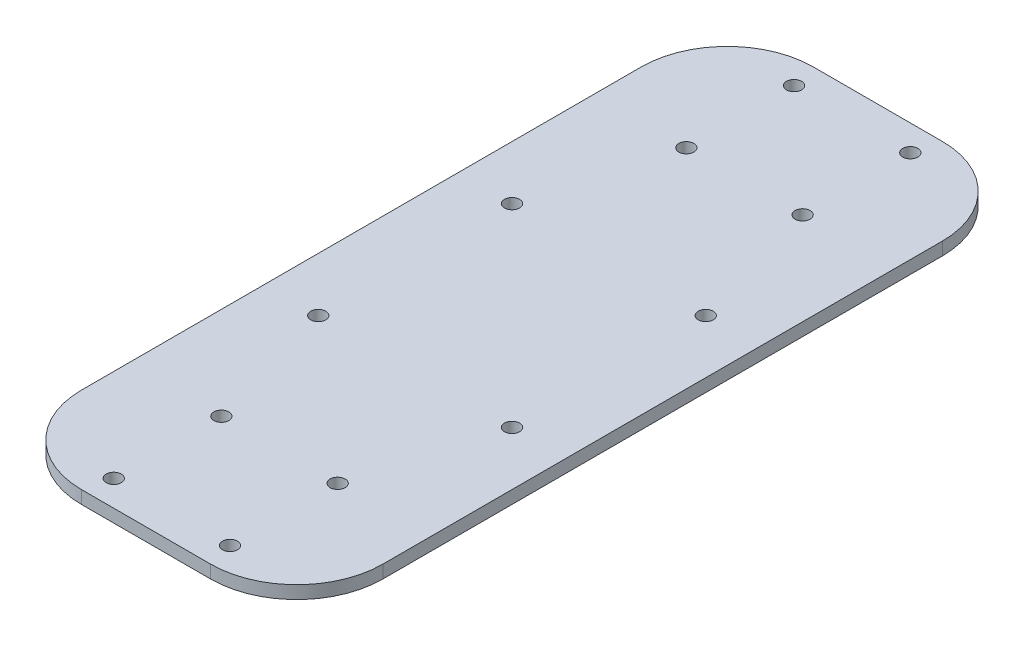
ISO-10303-21;
HEADER;
FILE_DESCRIPTION(('STEP AP214'),'2;1');
FILE_NAME('part.step','',(''),(''),'','','');
FILE_SCHEMA(('AUTOMOTIVE_DESIGN { 1 0 10303 214 1 1 1 1 }'));
ENDSEC;
DATA;
#1=APPLICATION_CONTEXT('core data for automotive mechanical design processes');
#2=APPLICATION_PROTOCOL_DEFINITION('international standard','automotive_design',2000,#1);
#3=PRODUCT_CONTEXT('',#1,'mechanical');
#4=PRODUCT('Part','Part','',(#3));
#5=PRODUCT_RELATED_PRODUCT_CATEGORY('part','',(#4));
#6=PRODUCT_DEFINITION_FORMATION('','',#4);
#7=PRODUCT_DEFINITION_CONTEXT('part definition',#1,'design');
#8=PRODUCT_DEFINITION('design','',#6,#7);
#9=PRODUCT_DEFINITION_SHAPE('','',#8);
#10=(LENGTH_UNIT() NAMED_UNIT(*) SI_UNIT(.MILLI.,.METRE.));
#11=(NAMED_UNIT(*) PLANE_ANGLE_UNIT() SI_UNIT($,.RADIAN.));
#12=(NAMED_UNIT(*) SI_UNIT($,.STERADIAN.) SOLID_ANGLE_UNIT());
#13=UNCERTAINTY_MEASURE_WITH_UNIT(LENGTH_MEASURE(1.E-05),#10,'distance_accuracy_value','');
#14=(GEOMETRIC_REPRESENTATION_CONTEXT(3) GLOBAL_UNCERTAINTY_ASSIGNED_CONTEXT((#13)) GLOBAL_UNIT_ASSIGNED_CONTEXT((#10,
#11,#12)) REPRESENTATION_CONTEXT('',''));
#15=CARTESIAN_POINT('',(0.,0.,0.));
#16=DIRECTION('',(0.,0.,1.));
#17=DIRECTION('',(1.,0.,0.));
#18=AXIS2_PLACEMENT_3D('',#15,#16,#17);
#19=CARTESIAN_POINT('',(0.,3.,0.));
#20=DIRECTION('',(0.,1.,0.));
#21=DIRECTION('',(0.,0.,1.));
#22=AXIS2_PLACEMENT_3D('',#19,#20,#21);
#23=PLANE('',#22);
#24=CARTESIAN_POINT('',(-13.5,3.,54.));
#25=DIRECTION('',(0.,-1.,0.));
#26=DIRECTION('',(0.,0.,-1.));
#27=AXIS2_PLACEMENT_3D('',#24,#25,#26);
#28=CIRCLE('',#27,1.75);
#29=CARTESIAN_POINT('',(-13.5,3.,52.25));
#30=VERTEX_POINT('',#29);
#31=EDGE_CURVE('E238',#30,#30,#28,.T.);
#32=ORIENTED_EDGE('',*,*,#31,.T.);
#33=EDGE_LOOP('',(#32));
#34=FACE_BOUND('',#33,.T.);
#35=CARTESIAN_POINT('',(13.5,3.,54.));
#36=DIRECTION('',(0.,-1.,0.));
#37=DIRECTION('',(0.,0.,-1.));
#38=AXIS2_PLACEMENT_3D('',#35,#36,#37);
#39=CIRCLE('',#38,1.75);
#40=CARTESIAN_POINT('',(13.5,3.,52.25));
#41=VERTEX_POINT('',#40);
#42=EDGE_CURVE('E244',#41,#41,#39,.T.);
#43=ORIENTED_EDGE('',*,*,#42,.T.);
#44=EDGE_LOOP('',(#43));
#45=FACE_BOUND('',#44,.T.);
#46=CARTESIAN_POINT('',(13.5,3.,79.));
#47=DIRECTION('',(0.,-1.,0.));
#48=DIRECTION('',(0.,0.,-1.));
#49=AXIS2_PLACEMENT_3D('',#46,#47,#48);
#50=CIRCLE('',#49,1.75);
#51=CARTESIAN_POINT('',(13.5,3.,77.25));
#52=VERTEX_POINT('',#51);
#53=EDGE_CURVE('E232',#52,#52,#50,.T.);
#54=ORIENTED_EDGE('',*,*,#53,.T.);
#55=EDGE_LOOP('',(#54));
#56=FACE_BOUND('',#55,.T.);
#57=CARTESIAN_POINT('',(-13.5,3.,79.));
#58=DIRECTION('',(0.,-1.,0.));
#59=DIRECTION('',(0.,0.,-1.));
#60=AXIS2_PLACEMENT_3D('',#57,#58,#59);
#61=CIRCLE('',#60,1.75);
#62=CARTESIAN_POINT('',(-13.5,3.,77.25));
#63=VERTEX_POINT('',#62);
#64=EDGE_CURVE('E215',#63,#63,#61,.T.);
#65=ORIENTED_EDGE('',*,*,#64,.T.);
#66=EDGE_LOOP('',(#65));
#67=FACE_BOUND('',#66,.T.);
#68=CARTESIAN_POINT('',(-13.5,3.,-54.));
#69=DIRECTION('',(0.,1.,0.));
#70=DIRECTION('',(0.,0.,1.));
#71=AXIS2_PLACEMENT_3D('',#68,#69,#70);
#72=CIRCLE('',#71,1.75);
#73=CARTESIAN_POINT('',(-13.5,3.,-52.25));
#74=VERTEX_POINT('',#73);
#75=EDGE_CURVE('E214',#74,#74,#72,.T.);
#76=ORIENTED_EDGE('',*,*,#75,.F.);
#77=EDGE_LOOP('',(#76));
#78=FACE_BOUND('',#77,.T.);
#79=CARTESIAN_POINT('',(13.5,3.,-54.));
#80=DIRECTION('',(0.,1.,0.));
#81=DIRECTION('',(0.,0.,1.));
#82=AXIS2_PLACEMENT_3D('',#79,#80,#81);
#83=CIRCLE('',#82,1.75);
#84=CARTESIAN_POINT('',(13.5,3.,-52.25));
#85=VERTEX_POINT('',#84);
#86=EDGE_CURVE('E221',#85,#85,#83,.T.);
#87=ORIENTED_EDGE('',*,*,#86,.F.);
#88=EDGE_LOOP('',(#87));
#89=FACE_BOUND('',#88,.T.);
#90=CARTESIAN_POINT('',(13.5,3.,-79.));
#91=DIRECTION('',(0.,1.,0.));
#92=DIRECTION('',(0.,0.,1.));
#93=AXIS2_PLACEMENT_3D('',#90,#91,#92);
#94=CIRCLE('',#93,1.75);
#95=CARTESIAN_POINT('',(13.5,3.,-77.25));
#96=VERTEX_POINT('',#95);
#97=EDGE_CURVE('E208',#96,#96,#94,.T.);
#98=ORIENTED_EDGE('',*,*,#97,.F.);
#99=EDGE_LOOP('',(#98));
#100=FACE_BOUND('',#99,.T.);
#101=CARTESIAN_POINT('',(-13.5,3.,-79.));
#102=DIRECTION('',(0.,1.,0.));
#103=DIRECTION('',(0.,0.,1.));
#104=AXIS2_PLACEMENT_3D('',#101,#102,#103);
#105=CIRCLE('',#104,1.75);
#106=CARTESIAN_POINT('',(-13.5,3.,-77.25));
#107=VERTEX_POINT('',#106);
#108=EDGE_CURVE('E202',#107,#107,#105,.T.);
#109=ORIENTED_EDGE('',*,*,#108,.F.);
#110=EDGE_LOOP('',(#109));
#111=FACE_BOUND('',#110,.T.);
#112=CARTESIAN_POINT('',(-22.5,3.,22.5));
#113=DIRECTION('',(0.,1.,0.));
#114=DIRECTION('',(0.,0.,-1.));
#115=AXIS2_PLACEMENT_3D('',#112,#113,#114);
#116=CIRCLE('',#115,1.75);
#117=CARTESIAN_POINT('',(-22.5,3.,20.75));
#118=VERTEX_POINT('',#117);
#119=EDGE_CURVE('E190',#118,#118,#116,.T.);
#120=ORIENTED_EDGE('',*,*,#119,.F.);
#121=EDGE_LOOP('',(#120));
#122=FACE_BOUND('',#121,.T.);
#123=CARTESIAN_POINT('',(-22.5,3.,-22.5));
#124=DIRECTION('',(0.,1.,0.));
#125=DIRECTION('',(0.,0.,1.));
#126=AXIS2_PLACEMENT_3D('',#123,#124,#125);
#127=CIRCLE('',#126,1.75);
#128=CARTESIAN_POINT('',(-22.5,3.,-20.75));
#129=VERTEX_POINT('',#128);
#130=EDGE_CURVE('E131',#129,#129,#127,.T.);
#131=ORIENTED_EDGE('',*,*,#130,.F.);
#132=EDGE_LOOP('',(#131));
#133=FACE_BOUND('',#132,.T.);
#134=DIRECTION('',(0.,0.,-1.));
#135=VECTOR('',#134,1.);
#136=CARTESIAN_POINT('',(35.,3.,85.));
#137=LINE('',#136,#135);
#138=CARTESIAN_POINT('',(35.,3.,65.));
#139=VERTEX_POINT('',#138);
#140=CARTESIAN_POINT('',(35.,3.,-65.));
#141=VERTEX_POINT('',#140);
#142=EDGE_CURVE('E140',#139,#141,#137,.T.);
#143=ORIENTED_EDGE('',*,*,#142,.T.);
#144=CARTESIAN_POINT('',(15.,3.,-65.));
#145=DIRECTION('',(0.,1.,0.));
#146=DIRECTION('',(0.,0.,1.));
#147=AXIS2_PLACEMENT_3D('',#144,#145,#146);
#148=CIRCLE('',#147,20.);
#149=CARTESIAN_POINT('',(15.,3.,-85.));
#150=VERTEX_POINT('',#149);
#151=EDGE_CURVE('E159',#141,#150,#148,.T.);
#152=ORIENTED_EDGE('',*,*,#151,.T.);
#153=DIRECTION('',(-1.,0.,0.));
#154=VECTOR('',#153,1.);
#155=CARTESIAN_POINT('',(35.,3.,-85.));
#156=LINE('',#155,#154);
#157=CARTESIAN_POINT('',(-15.,3.,-85.));
#158=VERTEX_POINT('',#157);
#159=EDGE_CURVE('E123',#150,#158,#156,.T.);
#160=ORIENTED_EDGE('',*,*,#159,.T.);
#161=CARTESIAN_POINT('',(-15.,3.,-65.));
#162=DIRECTION('',(0.,1.,0.));
#163=DIRECTION('',(0.,0.,1.));
#164=AXIS2_PLACEMENT_3D('',#161,#162,#163);
#165=CIRCLE('',#164,20.);
#166=CARTESIAN_POINT('',(-35.,3.,-65.));
#167=VERTEX_POINT('',#166);
#168=EDGE_CURVE('E157',#158,#167,#165,.T.);
#169=ORIENTED_EDGE('',*,*,#168,.T.);
#170=DIRECTION('',(0.,0.,1.));
#171=VECTOR('',#170,1.);
#172=CARTESIAN_POINT('',(-35.,3.,-85.));
#173=LINE('',#172,#171);
#174=CARTESIAN_POINT('',(-35.,3.,65.));
#175=VERTEX_POINT('',#174);
#176=EDGE_CURVE('E170',#167,#175,#173,.T.);
#177=ORIENTED_EDGE('',*,*,#176,.T.);
#178=CARTESIAN_POINT('',(-15.,3.,65.));
#179=DIRECTION('',(0.,1.,0.));
#180=DIRECTION('',(0.,0.,1.));
#181=AXIS2_PLACEMENT_3D('',#178,#179,#180);
#182=CIRCLE('',#181,20.);
#183=CARTESIAN_POINT('',(-15.,3.,85.));
#184=VERTEX_POINT('',#183);
#185=EDGE_CURVE('E58',#175,#184,#182,.T.);
#186=ORIENTED_EDGE('',*,*,#185,.T.);
#187=DIRECTION('',(1.,0.,0.));
#188=VECTOR('',#187,1.);
#189=CARTESIAN_POINT('',(35.,3.,85.));
#190=LINE('',#189,#188);
#191=CARTESIAN_POINT('',(15.,3.,85.));
#192=VERTEX_POINT('',#191);
#193=EDGE_CURVE('E178',#184,#192,#190,.T.);
#194=ORIENTED_EDGE('',*,*,#193,.T.);
#195=CARTESIAN_POINT('',(15.,3.,65.));
#196=DIRECTION('',(0.,1.,0.));
#197=DIRECTION('',(0.,0.,1.));
#198=AXIS2_PLACEMENT_3D('',#195,#196,#197);
#199=CIRCLE('',#198,20.);
#200=EDGE_CURVE('E154',#192,#139,#199,.T.);
#201=ORIENTED_EDGE('',*,*,#200,.T.);
#202=EDGE_LOOP('',(#143,#152,#160,#169,#177,#186,#194,#201));
#203=FACE_BOUND('',#202,.T.);
#204=CARTESIAN_POINT('',(22.5,3.,-22.5));
#205=DIRECTION('',(0.,1.,0.));
#206=DIRECTION('',(0.,0.,1.));
#207=AXIS2_PLACEMENT_3D('',#204,#205,#206);
#208=CIRCLE('',#207,1.75);
#209=CARTESIAN_POINT('',(22.5,3.,-20.75));
#210=VERTEX_POINT('',#209);
#211=EDGE_CURVE('E185',#210,#210,#208,.T.);
#212=ORIENTED_EDGE('',*,*,#211,.F.);
#213=EDGE_LOOP('',(#212));
#214=FACE_BOUND('',#213,.T.);
#215=CARTESIAN_POINT('',(22.5,3.,22.5));
#216=DIRECTION('',(0.,1.,0.));
#217=DIRECTION('',(0.,0.,-1.));
#218=AXIS2_PLACEMENT_3D('',#215,#216,#217);
#219=CIRCLE('',#218,1.75);
#220=CARTESIAN_POINT('',(22.5,3.,20.75));
#221=VERTEX_POINT('',#220);
#222=EDGE_CURVE('E196',#221,#221,#219,.T.);
#223=ORIENTED_EDGE('',*,*,#222,.F.);
#224=EDGE_LOOP('',(#223));
#225=FACE_BOUND('',#224,.T.);
#226=ADVANCED_FACE('F37',(#34,#45,#56,#67,#78,#89,#100,#111,#122,#133,#203,#214,#225),#23,.T.);
#227=CARTESIAN_POINT('',(0.,0.,0.));
#228=DIRECTION('',(0.,1.,0.));
#229=DIRECTION('',(0.,0.,1.));
#230=AXIS2_PLACEMENT_3D('',#227,#228,#229);
#231=PLANE('',#230);
#232=CARTESIAN_POINT('',(-13.5,0.,54.));
#233=DIRECTION('',(0.,-1.,0.));
#234=DIRECTION('',(0.,0.,-1.));
#235=AXIS2_PLACEMENT_3D('',#232,#233,#234);
#236=CIRCLE('',#235,1.75);
#237=CARTESIAN_POINT('',(-13.5,0.,52.25));
#238=VERTEX_POINT('',#237);
#239=EDGE_CURVE('E235',#238,#238,#236,.T.);
#240=ORIENTED_EDGE('',*,*,#239,.F.);
#241=EDGE_LOOP('',(#240));
#242=FACE_BOUND('',#241,.T.);
#243=CARTESIAN_POINT('',(13.5,0.,54.));
#244=DIRECTION('',(0.,-1.,0.));
#245=DIRECTION('',(0.,0.,-1.));
#246=AXIS2_PLACEMENT_3D('',#243,#244,#245);
#247=CIRCLE('',#246,1.75);
#248=CARTESIAN_POINT('',(13.5,0.,52.25));
#249=VERTEX_POINT('',#248);
#250=EDGE_CURVE('E241',#249,#249,#247,.T.);
#251=ORIENTED_EDGE('',*,*,#250,.F.);
#252=EDGE_LOOP('',(#251));
#253=FACE_BOUND('',#252,.T.);
#254=CARTESIAN_POINT('',(13.5,0.,79.));
#255=DIRECTION('',(0.,-1.,0.));
#256=DIRECTION('',(0.,0.,-1.));
#257=AXIS2_PLACEMENT_3D('',#254,#255,#256);
#258=CIRCLE('',#257,1.75);
#259=CARTESIAN_POINT('',(13.5,0.,77.25));
#260=VERTEX_POINT('',#259);
#261=EDGE_CURVE('E247',#260,#260,#258,.T.);
#262=ORIENTED_EDGE('',*,*,#261,.F.);
#263=EDGE_LOOP('',(#262));
#264=FACE_BOUND('',#263,.T.);
#265=CARTESIAN_POINT('',(-13.5,0.,79.));
#266=DIRECTION('',(0.,-1.,0.));
#267=DIRECTION('',(0.,0.,-1.));
#268=AXIS2_PLACEMENT_3D('',#265,#266,#267);
#269=CIRCLE('',#268,1.75);
#270=CARTESIAN_POINT('',(-13.5,0.,77.25));
#271=VERTEX_POINT('',#270);
#272=EDGE_CURVE('E229',#271,#271,#269,.T.);
#273=ORIENTED_EDGE('',*,*,#272,.F.);
#274=EDGE_LOOP('',(#273));
#275=FACE_BOUND('',#274,.T.);
#276=CARTESIAN_POINT('',(-13.5,0.,-54.));
#277=DIRECTION('',(0.,1.,0.));
#278=DIRECTION('',(0.,0.,1.));
#279=AXIS2_PLACEMENT_3D('',#276,#277,#278);
#280=CIRCLE('',#279,1.75);
#281=CARTESIAN_POINT('',(-13.5,0.,-52.25));
#282=VERTEX_POINT('',#281);
#283=EDGE_CURVE('E211',#282,#282,#280,.T.);
#284=ORIENTED_EDGE('',*,*,#283,.T.);
#285=EDGE_LOOP('',(#284));
#286=FACE_BOUND('',#285,.T.);
#287=CARTESIAN_POINT('',(13.5,0.,-54.));
#288=DIRECTION('',(0.,1.,0.));
#289=DIRECTION('',(0.,0.,1.));
#290=AXIS2_PLACEMENT_3D('',#287,#288,#289);
#291=CIRCLE('',#290,1.75);
#292=CARTESIAN_POINT('',(13.5,0.,-52.25));
#293=VERTEX_POINT('',#292);
#294=EDGE_CURVE('E218',#293,#293,#291,.T.);
#295=ORIENTED_EDGE('',*,*,#294,.T.);
#296=EDGE_LOOP('',(#295));
#297=FACE_BOUND('',#296,.T.);
#298=CARTESIAN_POINT('',(13.5,0.,-79.));
#299=DIRECTION('',(0.,1.,0.));
#300=DIRECTION('',(0.,0.,1.));
#301=AXIS2_PLACEMENT_3D('',#298,#299,#300);
#302=CIRCLE('',#301,1.75);
#303=CARTESIAN_POINT('',(13.5,0.,-77.25));
#304=VERTEX_POINT('',#303);
#305=EDGE_CURVE('E224',#304,#304,#302,.T.);
#306=ORIENTED_EDGE('',*,*,#305,.T.);
#307=EDGE_LOOP('',(#306));
#308=FACE_BOUND('',#307,.T.);
#309=CARTESIAN_POINT('',(-13.5,0.,-79.));
#310=DIRECTION('',(0.,1.,0.));
#311=DIRECTION('',(0.,0.,1.));
#312=AXIS2_PLACEMENT_3D('',#309,#310,#311);
#313=CIRCLE('',#312,1.75);
#314=CARTESIAN_POINT('',(-13.5,0.,-77.25));
#315=VERTEX_POINT('',#314);
#316=EDGE_CURVE('E205',#315,#315,#313,.T.);
#317=ORIENTED_EDGE('',*,*,#316,.T.);
#318=EDGE_LOOP('',(#317));
#319=FACE_BOUND('',#318,.T.);
#320=DIRECTION('',(-1.,0.,0.));
#321=VECTOR('',#320,1.);
#322=CARTESIAN_POINT('',(35.,0.,-85.));
#323=LINE('',#322,#321);
#324=CARTESIAN_POINT('',(15.,0.,-85.));
#325=VERTEX_POINT('',#324);
#326=CARTESIAN_POINT('',(-15.,0.,-85.));
#327=VERTEX_POINT('',#326);
#328=EDGE_CURVE('E120',#325,#327,#323,.T.);
#329=ORIENTED_EDGE('',*,*,#328,.F.);
#330=CARTESIAN_POINT('',(15.,0.,-65.));
#331=DIRECTION('',(0.,1.,0.));
#332=DIRECTION('',(0.,0.,1.));
#333=AXIS2_PLACEMENT_3D('',#330,#331,#332);
#334=CIRCLE('',#333,20.);
#335=CARTESIAN_POINT('',(35.,0.,-65.));
#336=VERTEX_POINT('',#335);
#337=EDGE_CURVE('E103',#325,#336,#334,.F.);
#338=ORIENTED_EDGE('',*,*,#337,.T.);
#339=DIRECTION('',(0.,0.,-1.));
#340=VECTOR('',#339,1.);
#341=CARTESIAN_POINT('',(35.,0.,85.));
#342=LINE('',#341,#340);
#343=CARTESIAN_POINT('',(35.,0.,65.));
#344=VERTEX_POINT('',#343);
#345=EDGE_CURVE('E144',#344,#336,#342,.T.);
#346=ORIENTED_EDGE('',*,*,#345,.F.);
#347=CARTESIAN_POINT('',(15.,0.,65.));
#348=DIRECTION('',(0.,1.,0.));
#349=DIRECTION('',(0.,0.,1.));
#350=AXIS2_PLACEMENT_3D('',#347,#348,#349);
#351=CIRCLE('',#350,20.);
#352=CARTESIAN_POINT('',(15.,0.,85.));
#353=VERTEX_POINT('',#352);
#354=EDGE_CURVE('E124',#344,#353,#351,.F.);
#355=ORIENTED_EDGE('',*,*,#354,.T.);
#356=DIRECTION('',(1.,0.,0.));
#357=VECTOR('',#356,1.);
#358=CARTESIAN_POINT('',(35.,0.,85.));
#359=LINE('',#358,#357);
#360=CARTESIAN_POINT('',(-15.,0.,85.));
#361=VERTEX_POINT('',#360);
#362=EDGE_CURVE('E134',#361,#353,#359,.T.);
#363=ORIENTED_EDGE('',*,*,#362,.F.);
#364=CARTESIAN_POINT('',(-15.,0.,65.));
#365=DIRECTION('',(0.,1.,0.));
#366=DIRECTION('',(0.,0.,1.));
#367=AXIS2_PLACEMENT_3D('',#364,#365,#366);
#368=CIRCLE('',#367,20.);
#369=CARTESIAN_POINT('',(-35.,0.,65.));
#370=VERTEX_POINT('',#369);
#371=EDGE_CURVE('E148',#361,#370,#368,.F.);
#372=ORIENTED_EDGE('',*,*,#371,.T.);
#373=DIRECTION('',(0.,0.,1.));
#374=VECTOR('',#373,1.);
#375=CARTESIAN_POINT('',(-35.,0.,-85.));
#376=LINE('',#375,#374);
#377=CARTESIAN_POINT('',(-35.,0.,-65.));
#378=VERTEX_POINT('',#377);
#379=EDGE_CURVE('E130',#378,#370,#376,.T.);
#380=ORIENTED_EDGE('',*,*,#379,.F.);
#381=CARTESIAN_POINT('',(-15.,0.,-65.));
#382=DIRECTION('',(0.,1.,0.));
#383=DIRECTION('',(0.,0.,1.));
#384=AXIS2_PLACEMENT_3D('',#381,#382,#383);
#385=CIRCLE('',#384,20.);
#386=EDGE_CURVE('E114',#378,#327,#385,.F.);
#387=ORIENTED_EDGE('',*,*,#386,.T.);
#388=EDGE_LOOP('',(#329,#338,#346,#355,#363,#372,#380,#387));
#389=FACE_BOUND('',#388,.T.);
#390=CARTESIAN_POINT('',(-22.5,0.,-22.5));
#391=DIRECTION('',(0.,1.,0.));
#392=DIRECTION('',(0.,0.,1.));
#393=AXIS2_PLACEMENT_3D('',#390,#391,#392);
#394=CIRCLE('',#393,1.75);
#395=CARTESIAN_POINT('',(-22.5,0.,-20.75));
#396=VERTEX_POINT('',#395);
#397=EDGE_CURVE('E137',#396,#396,#394,.T.);
#398=ORIENTED_EDGE('',*,*,#397,.T.);
#399=EDGE_LOOP('',(#398));
#400=FACE_BOUND('',#399,.T.);
#401=CARTESIAN_POINT('',(22.5,0.,-22.5));
#402=DIRECTION('',(0.,1.,0.));
#403=DIRECTION('',(0.,0.,1.));
#404=AXIS2_PLACEMENT_3D('',#401,#402,#403);
#405=CIRCLE('',#404,1.75);
#406=CARTESIAN_POINT('',(22.5,0.,-20.75));
#407=VERTEX_POINT('',#406);
#408=EDGE_CURVE('E187',#407,#407,#405,.T.);
#409=ORIENTED_EDGE('',*,*,#408,.T.);
#410=EDGE_LOOP('',(#409));
#411=FACE_BOUND('',#410,.T.);
#412=CARTESIAN_POINT('',(-22.5,0.,22.5));
#413=DIRECTION('',(0.,1.,0.));
#414=DIRECTION('',(0.,0.,-1.));
#415=AXIS2_PLACEMENT_3D('',#412,#413,#414);
#416=CIRCLE('',#415,1.75);
#417=CARTESIAN_POINT('',(-22.5,0.,20.75));
#418=VERTEX_POINT('',#417);
#419=EDGE_CURVE('E193',#418,#418,#416,.T.);
#420=ORIENTED_EDGE('',*,*,#419,.T.);
#421=EDGE_LOOP('',(#420));
#422=FACE_BOUND('',#421,.T.);
#423=CARTESIAN_POINT('',(22.5,0.,22.5));
#424=DIRECTION('',(0.,1.,0.));
#425=DIRECTION('',(0.,0.,-1.));
#426=AXIS2_PLACEMENT_3D('',#423,#424,#425);
#427=CIRCLE('',#426,1.75);
#428=CARTESIAN_POINT('',(22.5,0.,20.75));
#429=VERTEX_POINT('',#428);
#430=EDGE_CURVE('E199',#429,#429,#427,.T.);
#431=ORIENTED_EDGE('',*,*,#430,.T.);
#432=EDGE_LOOP('',(#431));
#433=FACE_BOUND('',#432,.T.);
#434=ADVANCED_FACE('F127',(#242,#253,#264,#275,#286,#297,#308,#319,#389,#400,#411,#422,#433),
#231,.F.);
#435=CARTESIAN_POINT('',(35.,3.,-85.));
#436=DIRECTION('',(0.,0.,1.));
#437=DIRECTION('',(1.,0.,0.));
#438=AXIS2_PLACEMENT_3D('',#435,#436,#437);
#439=PLANE('',#438);
#440=ORIENTED_EDGE('',*,*,#159,.F.);
#441=DIRECTION('',(0.,-1.,0.));
#442=VECTOR('',#441,1.);
#443=CARTESIAN_POINT('',(15.,3.,-85.));
#444=LINE('',#443,#442);
#445=EDGE_CURVE('E107',#150,#325,#444,.T.);
#446=ORIENTED_EDGE('',*,*,#445,.T.);
#447=ORIENTED_EDGE('',*,*,#328,.T.);
#448=DIRECTION('',(0.,-1.,0.));
#449=VECTOR('',#448,1.);
#450=CARTESIAN_POINT('',(-15.,3.,-85.));
#451=LINE('',#450,#449);
#452=EDGE_CURVE('E125',#327,#158,#451,.F.);
#453=ORIENTED_EDGE('',*,*,#452,.T.);
#454=EDGE_LOOP('',(#440,#446,#447,#453));
#455=FACE_BOUND('',#454,.T.);
#456=ADVANCED_FACE('F119',(#455),#439,.F.);
#457=CARTESIAN_POINT('',(-35.,3.,-85.));
#458=DIRECTION('',(1.,0.,0.));
#459=DIRECTION('',(0.,0.,-1.));
#460=AXIS2_PLACEMENT_3D('',#457,#458,#459);
#461=PLANE('',#460);
#462=ORIENTED_EDGE('',*,*,#176,.F.);
#463=DIRECTION('',(0.,-1.,0.));
#464=VECTOR('',#463,1.);
#465=CARTESIAN_POINT('',(-35.,3.,-65.));
#466=LINE('',#465,#464);
#467=EDGE_CURVE('E163',#167,#378,#466,.T.);
#468=ORIENTED_EDGE('',*,*,#467,.T.);
#469=ORIENTED_EDGE('',*,*,#379,.T.);
#470=DIRECTION('',(0.,-1.,0.));
#471=VECTOR('',#470,1.);
#472=CARTESIAN_POINT('',(-35.,3.,65.));
#473=LINE('',#472,#471);
#474=EDGE_CURVE('E161',#370,#175,#473,.F.);
#475=ORIENTED_EDGE('',*,*,#474,.T.);
#476=EDGE_LOOP('',(#462,#468,#469,#475));
#477=FACE_BOUND('',#476,.T.);
#478=ADVANCED_FACE('F168',(#477),#461,.F.);
#479=CARTESIAN_POINT('',(35.,3.,85.));
#480=DIRECTION('',(0.,0.,-1.));
#481=DIRECTION('',(-1.,0.,0.));
#482=AXIS2_PLACEMENT_3D('',#479,#480,#481);
#483=PLANE('',#482);
#484=ORIENTED_EDGE('',*,*,#193,.F.);
#485=DIRECTION('',(0.,-1.,0.));
#486=VECTOR('',#485,1.);
#487=CARTESIAN_POINT('',(-15.,3.,85.));
#488=LINE('',#487,#486);
#489=EDGE_CURVE('E11',#184,#361,#488,.T.);
#490=ORIENTED_EDGE('',*,*,#489,.T.);
#491=ORIENTED_EDGE('',*,*,#362,.T.);
#492=DIRECTION('',(0.,-1.,0.));
#493=VECTOR('',#492,1.);
#494=CARTESIAN_POINT('',(15.,3.,85.));
#495=LINE('',#494,#493);
#496=EDGE_CURVE('E45',#353,#192,#495,.F.);
#497=ORIENTED_EDGE('',*,*,#496,.T.);
#498=EDGE_LOOP('',(#484,#490,#491,#497));
#499=FACE_BOUND('',#498,.T.);
#500=ADVANCED_FACE('F177',(#499),#483,.F.);
#501=CARTESIAN_POINT('',(35.,3.,85.));
#502=DIRECTION('',(-1.,0.,0.));
#503=DIRECTION('',(0.,0.,1.));
#504=AXIS2_PLACEMENT_3D('',#501,#502,#503);
#505=PLANE('',#504);
#506=ORIENTED_EDGE('',*,*,#345,.T.);
#507=DIRECTION('',(0.,-1.,0.));
#508=VECTOR('',#507,1.);
#509=CARTESIAN_POINT('',(35.,3.,-65.));
#510=LINE('',#509,#508);
#511=EDGE_CURVE('E108',#336,#141,#510,.F.);
#512=ORIENTED_EDGE('',*,*,#511,.T.);
#513=ORIENTED_EDGE('',*,*,#142,.F.);
#514=DIRECTION('',(0.,-1.,0.));
#515=VECTOR('',#514,1.);
#516=CARTESIAN_POINT('',(35.,3.,65.));
#517=LINE('',#516,#515);
#518=EDGE_CURVE('E113',#139,#344,#517,.T.);
#519=ORIENTED_EDGE('',*,*,#518,.T.);
#520=EDGE_LOOP('',(#506,#512,#513,#519));
#521=FACE_BOUND('',#520,.T.);
#522=ADVANCED_FACE('F304',(#521),#505,.F.);
#523=CARTESIAN_POINT('',(-22.5,3.,-22.5));
#524=DIRECTION('',(0.,-1.,0.));
#525=DIRECTION('',(0.,0.,-1.));
#526=AXIS2_PLACEMENT_3D('',#523,#524,#525);
#527=CYLINDRICAL_SURFACE('',#526,1.75);
#528=ORIENTED_EDGE('',*,*,#130,.T.);
#529=EDGE_LOOP('',(#528));
#530=FACE_BOUND('',#529,.T.);
#531=ORIENTED_EDGE('',*,*,#397,.F.);
#532=EDGE_LOOP('',(#531));
#533=FACE_BOUND('',#532,.T.);
#534=ADVANCED_FACE('F301',(#530,#533),#527,.F.);
#535=CARTESIAN_POINT('',(22.5,3.,-22.5));
#536=DIRECTION('',(0.,-1.,0.));
#537=DIRECTION('',(0.,0.,-1.));
#538=AXIS2_PLACEMENT_3D('',#535,#536,#537);
#539=CYLINDRICAL_SURFACE('',#538,1.75);
#540=ORIENTED_EDGE('',*,*,#211,.T.);
#541=EDGE_LOOP('',(#540));
#542=FACE_BOUND('',#541,.T.);
#543=ORIENTED_EDGE('',*,*,#408,.F.);
#544=EDGE_LOOP('',(#543));
#545=FACE_BOUND('',#544,.T.);
#546=ADVANCED_FACE('F336',(#542,#545),#539,.F.);
#547=CARTESIAN_POINT('',(-22.5,3.,22.5));
#548=DIRECTION('',(0.,-1.,0.));
#549=DIRECTION('',(0.,0.,-1.));
#550=AXIS2_PLACEMENT_3D('',#547,#548,#549);
#551=CYLINDRICAL_SURFACE('',#550,1.75);
#552=ORIENTED_EDGE('',*,*,#119,.T.);
#553=EDGE_LOOP('',(#552));
#554=FACE_BOUND('',#553,.T.);
#555=ORIENTED_EDGE('',*,*,#419,.F.);
#556=EDGE_LOOP('',(#555));
#557=FACE_BOUND('',#556,.T.);
#558=ADVANCED_FACE('F290',(#554,#557),#551,.F.);
#559=CARTESIAN_POINT('',(22.5,3.,22.5));
#560=DIRECTION('',(0.,-1.,0.));
#561=DIRECTION('',(0.,0.,-1.));
#562=AXIS2_PLACEMENT_3D('',#559,#560,#561);
#563=CYLINDRICAL_SURFACE('',#562,1.75);
#564=ORIENTED_EDGE('',*,*,#222,.T.);
#565=EDGE_LOOP('',(#564));
#566=FACE_BOUND('',#565,.T.);
#567=ORIENTED_EDGE('',*,*,#430,.F.);
#568=EDGE_LOOP('',(#567));
#569=FACE_BOUND('',#568,.T.);
#570=ADVANCED_FACE('F280',(#566,#569),#563,.F.);
#571=CARTESIAN_POINT('',(-13.5,3.,-79.));
#572=DIRECTION('',(0.,-1.,0.));
#573=DIRECTION('',(0.,0.,-1.));
#574=AXIS2_PLACEMENT_3D('',#571,#572,#573);
#575=CYLINDRICAL_SURFACE('',#574,1.75);
#576=ORIENTED_EDGE('',*,*,#108,.T.);
#577=EDGE_LOOP('',(#576));
#578=FACE_BOUND('',#577,.T.);
#579=ORIENTED_EDGE('',*,*,#316,.F.);
#580=EDGE_LOOP('',(#579));
#581=FACE_BOUND('',#580,.T.);
#582=ADVANCED_FACE('F277',(#578,#581),#575,.F.);
#583=CARTESIAN_POINT('',(13.5,3.,-79.));
#584=DIRECTION('',(0.,-1.,0.));
#585=DIRECTION('',(0.,0.,-1.));
#586=AXIS2_PLACEMENT_3D('',#583,#584,#585);
#587=CYLINDRICAL_SURFACE('',#586,1.75);
#588=ORIENTED_EDGE('',*,*,#97,.T.);
#589=EDGE_LOOP('',(#588));
#590=FACE_BOUND('',#589,.T.);
#591=ORIENTED_EDGE('',*,*,#305,.F.);
#592=EDGE_LOOP('',(#591));
#593=FACE_BOUND('',#592,.T.);
#594=ADVANCED_FACE('F279',(#590,#593),#587,.F.);
#595=CARTESIAN_POINT('',(13.5,3.,-54.));
#596=DIRECTION('',(0.,-1.,0.));
#597=DIRECTION('',(0.,0.,-1.));
#598=AXIS2_PLACEMENT_3D('',#595,#596,#597);
#599=CYLINDRICAL_SURFACE('',#598,1.75);
#600=ORIENTED_EDGE('',*,*,#86,.T.);
#601=EDGE_LOOP('',(#600));
#602=FACE_BOUND('',#601,.T.);
#603=ORIENTED_EDGE('',*,*,#294,.F.);
#604=EDGE_LOOP('',(#603));
#605=FACE_BOUND('',#604,.T.);
#606=ADVANCED_FACE('F287',(#602,#605),#599,.F.);
#607=CARTESIAN_POINT('',(-13.5,3.,-54.));
#608=DIRECTION('',(0.,-1.,0.));
#609=DIRECTION('',(0.,0.,-1.));
#610=AXIS2_PLACEMENT_3D('',#607,#608,#609);
#611=CYLINDRICAL_SURFACE('',#610,1.75);
#612=ORIENTED_EDGE('',*,*,#75,.T.);
#613=EDGE_LOOP('',(#612));
#614=FACE_BOUND('',#613,.T.);
#615=ORIENTED_EDGE('',*,*,#283,.F.);
#616=EDGE_LOOP('',(#615));
#617=FACE_BOUND('',#616,.T.);
#618=ADVANCED_FACE('F394',(#614,#617),#611,.F.);
#619=CARTESIAN_POINT('',(-13.5,3.,79.));
#620=DIRECTION('',(0.,-1.,0.));
#621=DIRECTION('',(0.,0.,-1.));
#622=AXIS2_PLACEMENT_3D('',#619,#620,#621);
#623=CYLINDRICAL_SURFACE('',#622,1.75);
#624=ORIENTED_EDGE('',*,*,#64,.F.);
#625=EDGE_LOOP('',(#624));
#626=FACE_BOUND('',#625,.T.);
#627=ORIENTED_EDGE('',*,*,#272,.T.);
#628=EDGE_LOOP('',(#627));
#629=FACE_BOUND('',#628,.T.);
#630=ADVANCED_FACE('F259',(#626,#629),#623,.F.);
#631=CARTESIAN_POINT('',(13.5,3.,79.));
#632=DIRECTION('',(0.,-1.,0.));
#633=DIRECTION('',(0.,0.,-1.));
#634=AXIS2_PLACEMENT_3D('',#631,#632,#633);
#635=CYLINDRICAL_SURFACE('',#634,1.75);
#636=ORIENTED_EDGE('',*,*,#53,.F.);
#637=EDGE_LOOP('',(#636));
#638=FACE_BOUND('',#637,.T.);
#639=ORIENTED_EDGE('',*,*,#261,.T.);
#640=EDGE_LOOP('',(#639));
#641=FACE_BOUND('',#640,.T.);
#642=ADVANCED_FACE('F255',(#638,#641),#635,.F.);
#643=CARTESIAN_POINT('',(13.5,3.,54.));
#644=DIRECTION('',(0.,-1.,0.));
#645=DIRECTION('',(0.,0.,-1.));
#646=AXIS2_PLACEMENT_3D('',#643,#644,#645);
#647=CYLINDRICAL_SURFACE('',#646,1.75);
#648=ORIENTED_EDGE('',*,*,#42,.F.);
#649=EDGE_LOOP('',(#648));
#650=FACE_BOUND('',#649,.T.);
#651=ORIENTED_EDGE('',*,*,#250,.T.);
#652=EDGE_LOOP('',(#651));
#653=FACE_BOUND('',#652,.T.);
#654=ADVANCED_FACE('F258',(#650,#653),#647,.F.);
#655=CARTESIAN_POINT('',(-13.5,3.,54.));
#656=DIRECTION('',(0.,-1.,0.));
#657=DIRECTION('',(0.,0.,-1.));
#658=AXIS2_PLACEMENT_3D('',#655,#656,#657);
#659=CYLINDRICAL_SURFACE('',#658,1.75);
#660=ORIENTED_EDGE('',*,*,#31,.F.);
#661=EDGE_LOOP('',(#660));
#662=FACE_BOUND('',#661,.T.);
#663=ORIENTED_EDGE('',*,*,#239,.T.);
#664=EDGE_LOOP('',(#663));
#665=FACE_BOUND('',#664,.T.);
#666=ADVANCED_FACE('F317',(#662,#665),#659,.F.);
#667=CARTESIAN_POINT('',(15.,3.,-65.));
#668=DIRECTION('',(0.,-1.,0.));
#669=DIRECTION('',(0.,0.,-1.));
#670=AXIS2_PLACEMENT_3D('',#667,#668,#669);
#671=CYLINDRICAL_SURFACE('',#670,20.);
#672=ORIENTED_EDGE('',*,*,#151,.F.);
#673=ORIENTED_EDGE('',*,*,#511,.F.);
#674=ORIENTED_EDGE('',*,*,#337,.F.);
#675=ORIENTED_EDGE('',*,*,#445,.F.);
#676=EDGE_LOOP('',(#672,#673,#674,#675));
#677=FACE_BOUND('',#676,.T.);
#678=ADVANCED_FACE('F106',(#677),#671,.T.);
#679=CARTESIAN_POINT('',(-15.,3.,-65.));
#680=DIRECTION('',(0.,-1.,0.));
#681=DIRECTION('',(0.,0.,-1.));
#682=AXIS2_PLACEMENT_3D('',#679,#680,#681);
#683=CYLINDRICAL_SURFACE('',#682,20.);
#684=ORIENTED_EDGE('',*,*,#168,.F.);
#685=ORIENTED_EDGE('',*,*,#452,.F.);
#686=ORIENTED_EDGE('',*,*,#386,.F.);
#687=ORIENTED_EDGE('',*,*,#467,.F.);
#688=EDGE_LOOP('',(#684,#685,#686,#687));
#689=FACE_BOUND('',#688,.T.);
#690=ADVANCED_FACE('F316',(#689),#683,.T.);
#691=CARTESIAN_POINT('',(-15.,3.,65.));
#692=DIRECTION('',(0.,-1.,0.));
#693=DIRECTION('',(0.,0.,-1.));
#694=AXIS2_PLACEMENT_3D('',#691,#692,#693);
#695=CYLINDRICAL_SURFACE('',#694,20.);
#696=ORIENTED_EDGE('',*,*,#185,.F.);
#697=ORIENTED_EDGE('',*,*,#474,.F.);
#698=ORIENTED_EDGE('',*,*,#371,.F.);
#699=ORIENTED_EDGE('',*,*,#489,.F.);
#700=EDGE_LOOP('',(#696,#697,#698,#699));
#701=FACE_BOUND('',#700,.T.);
#702=ADVANCED_FACE('F176',(#701),#695,.T.);
#703=CARTESIAN_POINT('',(15.,3.,65.));
#704=DIRECTION('',(0.,-1.,0.));
#705=DIRECTION('',(0.,0.,-1.));
#706=AXIS2_PLACEMENT_3D('',#703,#704,#705);
#707=CYLINDRICAL_SURFACE('',#706,20.);
#708=ORIENTED_EDGE('',*,*,#200,.F.);
#709=ORIENTED_EDGE('',*,*,#496,.F.);
#710=ORIENTED_EDGE('',*,*,#354,.F.);
#711=ORIENTED_EDGE('',*,*,#518,.F.);
#712=EDGE_LOOP('',(#708,#709,#710,#711));
#713=FACE_BOUND('',#712,.T.);
#714=ADVANCED_FACE('F39',(#713),#707,.T.);
#715=CLOSED_SHELL('',(#226,#434,#456,#478,#500,#522,#534,#546,#558,#570,#582,#594,#606,#618,
#630,#642,#654,#666,#678,#690,#702,#714));
#716=MANIFOLD_SOLID_BREP('B2',#715);
#717=ADVANCED_BREP_SHAPE_REPRESENTATION('',(#18,#716),#14);
#718=SHAPE_DEFINITION_REPRESENTATION(#9,#717);
ENDSEC;
END-ISO-10303-21;
